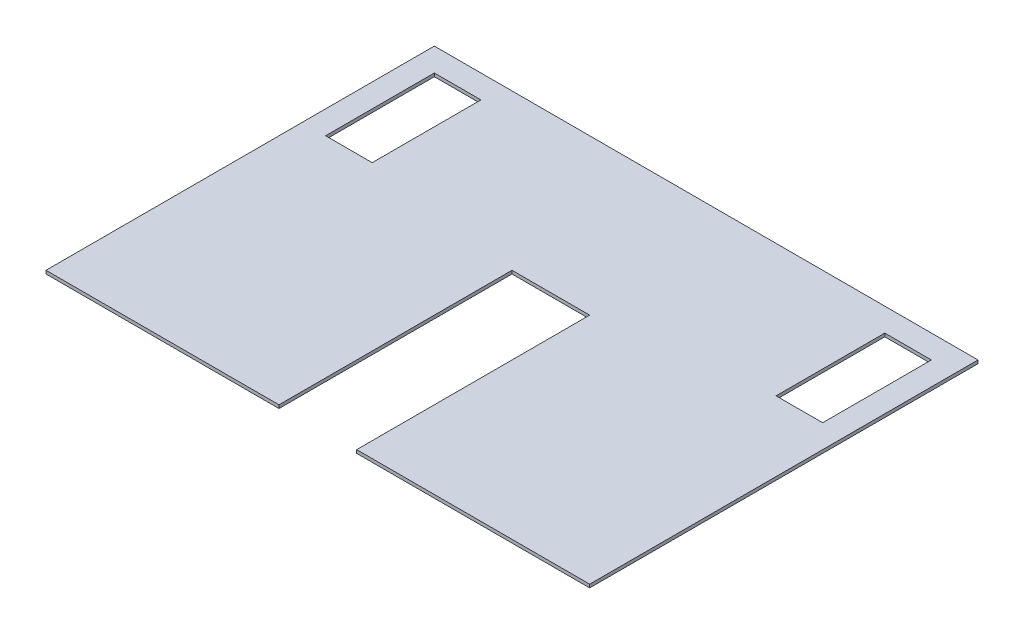
ISO-10303-21;
HEADER;
FILE_DESCRIPTION(('STEP AP214'),'2;1');
FILE_NAME('part.step','',(''),(''),'','','');
FILE_SCHEMA(('AUTOMOTIVE_DESIGN { 1 0 10303 214 1 1 1 1 }'));
ENDSEC;
DATA;
#1=APPLICATION_CONTEXT('core data for automotive mechanical design processes');
#2=APPLICATION_PROTOCOL_DEFINITION('international standard','automotive_design',2000,#1);
#3=PRODUCT_CONTEXT('',#1,'mechanical');
#4=PRODUCT('Part','Part','',(#3));
#5=PRODUCT_RELATED_PRODUCT_CATEGORY('part','',(#4));
#6=PRODUCT_DEFINITION_FORMATION('','',#4);
#7=PRODUCT_DEFINITION_CONTEXT('part definition',#1,'design');
#8=PRODUCT_DEFINITION('design','',#6,#7);
#9=PRODUCT_DEFINITION_SHAPE('','',#8);
#10=(LENGTH_UNIT() NAMED_UNIT(*) SI_UNIT(.MILLI.,.METRE.));
#11=(NAMED_UNIT(*) PLANE_ANGLE_UNIT() SI_UNIT($,.RADIAN.));
#12=(NAMED_UNIT(*) SI_UNIT($,.STERADIAN.) SOLID_ANGLE_UNIT());
#13=UNCERTAINTY_MEASURE_WITH_UNIT(LENGTH_MEASURE(1.E-05),#10,'distance_accuracy_value','');
#14=(GEOMETRIC_REPRESENTATION_CONTEXT(3) GLOBAL_UNCERTAINTY_ASSIGNED_CONTEXT((#13)) GLOBAL_UNIT_ASSIGNED_CONTEXT((#10,
#11,#12)) REPRESENTATION_CONTEXT('',''));
#15=CARTESIAN_POINT('',(0.,0.,0.));
#16=DIRECTION('',(0.,0.,1.));
#17=DIRECTION('',(1.,0.,0.));
#18=AXIS2_PLACEMENT_3D('',#15,#16,#17);
#19=CARTESIAN_POINT('',(0.,1.0668,0.));
#20=DIRECTION('',(0.,0.,-1.));
#21=DIRECTION('',(-1.,0.,0.));
#22=AXIS2_PLACEMENT_3D('',#19,#20,#21);
#23=PLANE('',#22);
#24=DIRECTION('',(1.,0.,0.));
#25=VECTOR('',#24,1.);
#26=CARTESIAN_POINT('',(0.,0.,0.));
#27=LINE('',#26,#25);
#28=CARTESIAN_POINT('',(-177.8,0.,0.));
#29=VERTEX_POINT('',#28);
#30=CARTESIAN_POINT('',(-101.6,0.,0.));
#31=VERTEX_POINT('',#30);
#32=EDGE_CURVE('E247',#29,#31,#27,.T.);
#33=ORIENTED_EDGE('',*,*,#32,.T.);
#34=DIRECTION('',(0.,1.,0.));
#35=VECTOR('',#34,1.);
#36=CARTESIAN_POINT('',(-101.6,0.,0.));
#37=LINE('',#36,#35);
#38=CARTESIAN_POINT('',(-101.6,1.0668,0.));
#39=VERTEX_POINT('',#38);
#40=EDGE_CURVE('E234',#31,#39,#37,.T.);
#41=ORIENTED_EDGE('',*,*,#40,.T.);
#42=DIRECTION('',(1.,0.,0.));
#43=VECTOR('',#42,1.);
#44=CARTESIAN_POINT('',(0.,1.0668,0.));
#45=LINE('',#44,#43);
#46=CARTESIAN_POINT('',(-177.8,1.0668,0.));
#47=VERTEX_POINT('',#46);
#48=EDGE_CURVE('E252',#47,#39,#45,.T.);
#49=ORIENTED_EDGE('',*,*,#48,.F.);
#50=DIRECTION('',(0.,-1.,0.));
#51=VECTOR('',#50,1.);
#52=CARTESIAN_POINT('',(-177.8,1.0668,0.));
#53=LINE('',#52,#51);
#54=EDGE_CURVE('E267',#47,#29,#53,.T.);
#55=ORIENTED_EDGE('',*,*,#54,.T.);
#56=EDGE_LOOP('',(#33,#41,#49,#55));
#57=FACE_BOUND('',#56,.T.);
#58=ADVANCED_FACE('F35',(#57),#23,.F.);
#59=CARTESIAN_POINT('',(0.,1.0668,0.));
#60=DIRECTION('',(-1.,0.,0.));
#61=DIRECTION('',(0.,0.,1.));
#62=AXIS2_PLACEMENT_3D('',#59,#60,#61);
#63=PLANE('',#62);
#64=DIRECTION('',(0.,0.,-1.));
#65=VECTOR('',#64,1.);
#66=CARTESIAN_POINT('',(0.,0.,0.));
#67=LINE('',#66,#65);
#68=CARTESIAN_POINT('',(0.,0.,0.));
#69=VERTEX_POINT('',#68);
#70=CARTESIAN_POINT('',(0.,0.,-127.));
#71=VERTEX_POINT('',#70);
#72=EDGE_CURVE('E237',#69,#71,#67,.T.);
#73=ORIENTED_EDGE('',*,*,#72,.T.);
#74=DIRECTION('',(0.,-1.,0.));
#75=VECTOR('',#74,1.);
#76=CARTESIAN_POINT('',(0.,1.0668,-127.));
#77=LINE('',#76,#75);
#78=CARTESIAN_POINT('',(0.,1.0668,-127.));
#79=VERTEX_POINT('',#78);
#80=EDGE_CURVE('E11',#79,#71,#77,.T.);
#81=ORIENTED_EDGE('',*,*,#80,.F.);
#82=DIRECTION('',(0.,0.,-1.));
#83=VECTOR('',#82,1.);
#84=CARTESIAN_POINT('',(0.,1.0668,0.));
#85=LINE('',#84,#83);
#86=CARTESIAN_POINT('',(0.,1.0668,0.));
#87=VERTEX_POINT('',#86);
#88=EDGE_CURVE('E243',#87,#79,#85,.T.);
#89=ORIENTED_EDGE('',*,*,#88,.F.);
#90=DIRECTION('',(0.,-1.,0.));
#91=VECTOR('',#90,1.);
#92=CARTESIAN_POINT('',(0.,1.0668,0.));
#93=LINE('',#92,#91);
#94=EDGE_CURVE('E255',#87,#69,#93,.T.);
#95=ORIENTED_EDGE('',*,*,#94,.T.);
#96=EDGE_LOOP('',(#73,#81,#89,#95));
#97=FACE_BOUND('',#96,.T.);
#98=ADVANCED_FACE('F37',(#97),#63,.F.);
#99=CARTESIAN_POINT('',(0.,1.0668,-127.));
#100=DIRECTION('',(0.,0.,1.));
#101=DIRECTION('',(1.,0.,0.));
#102=AXIS2_PLACEMENT_3D('',#99,#100,#101);
#103=PLANE('',#102);
#104=DIRECTION('',(-1.,0.,0.));
#105=VECTOR('',#104,1.);
#106=CARTESIAN_POINT('',(0.,0.,-127.));
#107=LINE('',#106,#105);
#108=CARTESIAN_POINT('',(-177.8,0.,-127.));
#109=VERTEX_POINT('',#108);
#110=EDGE_CURVE('E258',#71,#109,#107,.T.);
#111=ORIENTED_EDGE('',*,*,#110,.T.);
#112=DIRECTION('',(0.,-1.,0.));
#113=VECTOR('',#112,1.);
#114=CARTESIAN_POINT('',(-177.8,1.0668,-127.));
#115=LINE('',#114,#113);
#116=CARTESIAN_POINT('',(-177.8,1.0668,-127.));
#117=VERTEX_POINT('',#116);
#118=EDGE_CURVE('E43',#117,#109,#115,.T.);
#119=ORIENTED_EDGE('',*,*,#118,.F.);
#120=DIRECTION('',(-1.,0.,0.));
#121=VECTOR('',#120,1.);
#122=CARTESIAN_POINT('',(0.,1.0668,-127.));
#123=LINE('',#122,#121);
#124=EDGE_CURVE('E246',#79,#117,#123,.T.);
#125=ORIENTED_EDGE('',*,*,#124,.F.);
#126=ORIENTED_EDGE('',*,*,#80,.T.);
#127=EDGE_LOOP('',(#111,#119,#125,#126));
#128=FACE_BOUND('',#127,.T.);
#129=ADVANCED_FACE('F289',(#128),#103,.F.);
#130=CARTESIAN_POINT('',(-177.8,1.0668,0.));
#131=DIRECTION('',(1.,0.,0.));
#132=DIRECTION('',(0.,0.,-1.));
#133=AXIS2_PLACEMENT_3D('',#130,#131,#132);
#134=PLANE('',#133);
#135=DIRECTION('',(0.,0.,1.));
#136=VECTOR('',#135,1.);
#137=CARTESIAN_POINT('',(-177.8,0.,0.));
#138=LINE('',#137,#136);
#139=EDGE_CURVE('E260',#109,#29,#138,.T.);
#140=ORIENTED_EDGE('',*,*,#139,.T.);
#141=ORIENTED_EDGE('',*,*,#54,.F.);
#142=DIRECTION('',(0.,0.,1.));
#143=VECTOR('',#142,1.);
#144=CARTESIAN_POINT('',(-177.8,1.0668,0.));
#145=LINE('',#144,#143);
#146=EDGE_CURVE('E249',#117,#47,#145,.T.);
#147=ORIENTED_EDGE('',*,*,#146,.F.);
#148=ORIENTED_EDGE('',*,*,#118,.T.);
#149=EDGE_LOOP('',(#140,#141,#147,#148));
#150=FACE_BOUND('',#149,.T.);
#151=ADVANCED_FACE('F274',(#150),#134,.F.);
#152=CARTESIAN_POINT('',(-76.1999999999999,1.0668,0.));
#153=VERTEX_POINT('',#152);
#154=EDGE_CURVE('E251',#153,#87,#45,.T.);
#155=ORIENTED_EDGE('',*,*,#154,.F.);
#156=DIRECTION('',(0.,1.,0.));
#157=VECTOR('',#156,1.);
#158=CARTESIAN_POINT('',(-76.1999999999999,0.,0.));
#159=LINE('',#158,#157);
#160=CARTESIAN_POINT('',(-76.1999999999999,0.,0.));
#161=VERTEX_POINT('',#160);
#162=EDGE_CURVE('E227',#161,#153,#159,.T.);
#163=ORIENTED_EDGE('',*,*,#162,.F.);
#164=EDGE_CURVE('E262',#161,#69,#27,.T.);
#165=ORIENTED_EDGE('',*,*,#164,.T.);
#166=ORIENTED_EDGE('',*,*,#94,.F.);
#167=EDGE_LOOP('',(#155,#163,#165,#166));
#168=FACE_BOUND('',#167,.T.);
#169=ADVANCED_FACE('F296',(#168),#23,.F.);
#170=CARTESIAN_POINT('',(0.,1.0668,0.));
#171=DIRECTION('',(0.,1.,0.));
#172=DIRECTION('',(0.,0.,1.));
#173=AXIS2_PLACEMENT_3D('',#170,#171,#172);
#174=PLANE('',#173);
#175=DIRECTION('',(-1.,0.,0.));
#176=VECTOR('',#175,1.);
#177=CARTESIAN_POINT('',(-7.62000000000001,1.0668,-119.38));
#178=LINE('',#177,#176);
#179=CARTESIAN_POINT('',(-7.62000000000001,1.0668,-119.38));
#180=VERTEX_POINT('',#179);
#181=CARTESIAN_POINT('',(-22.8599999999999,1.0668,-119.38));
#182=VERTEX_POINT('',#181);
#183=EDGE_CURVE('E50',#180,#182,#178,.T.);
#184=ORIENTED_EDGE('',*,*,#183,.F.);
#185=DIRECTION('',(0.,0.,-1.));
#186=VECTOR('',#185,1.);
#187=CARTESIAN_POINT('',(-7.62000000000001,1.0668,-119.38));
#188=LINE('',#187,#186);
#189=CARTESIAN_POINT('',(-7.62000000000001,1.0668,-83.8199999999995));
#190=VERTEX_POINT('',#189);
#191=EDGE_CURVE('E166',#190,#180,#188,.T.);
#192=ORIENTED_EDGE('',*,*,#191,.F.);
#193=DIRECTION('',(1.,0.,0.));
#194=VECTOR('',#193,1.);
#195=CARTESIAN_POINT('',(-22.8599999999999,1.0668,-83.8199999999995));
#196=LINE('',#195,#194);
#197=CARTESIAN_POINT('',(-22.8599999999999,1.0668,-83.8199999999995));
#198=VERTEX_POINT('',#197);
#199=EDGE_CURVE('E169',#198,#190,#196,.T.);
#200=ORIENTED_EDGE('',*,*,#199,.F.);
#201=DIRECTION('',(0.,0.,1.));
#202=VECTOR('',#201,1.);
#203=CARTESIAN_POINT('',(-22.8599999999999,1.0668,-119.38));
#204=LINE('',#203,#202);
#205=EDGE_CURVE('E175',#182,#198,#204,.T.);
#206=ORIENTED_EDGE('',*,*,#205,.F.);
#207=EDGE_LOOP('',(#184,#192,#200,#206));
#208=FACE_BOUND('',#207,.T.);
#209=DIRECTION('',(0.,0.,1.));
#210=VECTOR('',#209,1.);
#211=CARTESIAN_POINT('',(-170.18,1.0668,-119.38));
#212=LINE('',#211,#210);
#213=CARTESIAN_POINT('',(-170.18,1.0668,-119.38));
#214=VERTEX_POINT('',#213);
#215=CARTESIAN_POINT('',(-170.18,1.0668,-83.8200000000001));
#216=VERTEX_POINT('',#215);
#217=EDGE_CURVE('E181',#214,#216,#212,.T.);
#218=ORIENTED_EDGE('',*,*,#217,.F.);
#219=DIRECTION('',(-1.,0.,0.));
#220=VECTOR('',#219,1.);
#221=CARTESIAN_POINT('',(-154.94,1.0668,-119.38));
#222=LINE('',#221,#220);
#223=CARTESIAN_POINT('',(-154.94,1.0668,-119.38));
#224=VERTEX_POINT('',#223);
#225=EDGE_CURVE('E189',#224,#214,#222,.T.);
#226=ORIENTED_EDGE('',*,*,#225,.F.);
#227=DIRECTION('',(0.,0.,-1.));
#228=VECTOR('',#227,1.);
#229=CARTESIAN_POINT('',(-154.94,1.0668,-83.8200000000001));
#230=LINE('',#229,#228);
#231=CARTESIAN_POINT('',(-154.94,1.0668,-83.8200000000001));
#232=VERTEX_POINT('',#231);
#233=EDGE_CURVE('E203',#232,#224,#230,.T.);
#234=ORIENTED_EDGE('',*,*,#233,.F.);
#235=DIRECTION('',(1.,0.,0.));
#236=VECTOR('',#235,1.);
#237=CARTESIAN_POINT('',(-170.18,1.0668,-83.8200000000001));
#238=LINE('',#237,#236);
#239=EDGE_CURVE('E200',#216,#232,#238,.T.);
#240=ORIENTED_EDGE('',*,*,#239,.F.);
#241=EDGE_LOOP('',(#218,#226,#234,#240));
#242=FACE_BOUND('',#241,.T.);
#243=DIRECTION('',(0.,0.,1.));
#244=VECTOR('',#243,1.);
#245=CARTESIAN_POINT('',(-101.6,1.0668,-76.1999999999995));
#246=LINE('',#245,#244);
#247=CARTESIAN_POINT('',(-101.6,1.0668,-76.1999999999995));
#248=VERTEX_POINT('',#247);
#249=EDGE_CURVE('E221',#248,#39,#246,.T.);
#250=ORIENTED_EDGE('',*,*,#249,.F.);
#251=DIRECTION('',(-1.,0.,0.));
#252=VECTOR('',#251,1.);
#253=CARTESIAN_POINT('',(-101.6,1.0668,-76.1999999999995));
#254=LINE('',#253,#252);
#255=CARTESIAN_POINT('',(-76.1999999999998,1.0668,-76.1999999999995));
#256=VERTEX_POINT('',#255);
#257=EDGE_CURVE('E230',#256,#248,#254,.T.);
#258=ORIENTED_EDGE('',*,*,#257,.F.);
#259=DIRECTION('',(0.,0.,-1.));
#260=VECTOR('',#259,1.);
#261=CARTESIAN_POINT('',(-76.1999999999998,1.0668,-76.1999999999995));
#262=LINE('',#261,#260);
#263=EDGE_CURVE('E210',#153,#256,#262,.T.);
#264=ORIENTED_EDGE('',*,*,#263,.F.);
#265=ORIENTED_EDGE('',*,*,#154,.T.);
#266=ORIENTED_EDGE('',*,*,#88,.T.);
#267=ORIENTED_EDGE('',*,*,#124,.T.);
#268=ORIENTED_EDGE('',*,*,#146,.T.);
#269=ORIENTED_EDGE('',*,*,#48,.T.);
#270=EDGE_LOOP('',(#250,#258,#264,#265,#266,#267,#268,#269));
#271=FACE_BOUND('',#270,.T.);
#272=ADVANCED_FACE('F285',(#208,#242,#271),#174,.T.);
#273=CARTESIAN_POINT('',(0.,0.,0.));
#274=DIRECTION('',(0.,1.,0.));
#275=DIRECTION('',(0.,0.,1.));
#276=AXIS2_PLACEMENT_3D('',#273,#274,#275);
#277=PLANE('',#276);
#278=DIRECTION('',(0.,0.,-1.));
#279=VECTOR('',#278,1.);
#280=CARTESIAN_POINT('',(-7.62000000000001,0.,-119.38));
#281=LINE('',#280,#279);
#282=CARTESIAN_POINT('',(-7.62000000000001,0.,-83.8199999999995));
#283=VERTEX_POINT('',#282);
#284=CARTESIAN_POINT('',(-7.62000000000001,0.,-119.38));
#285=VERTEX_POINT('',#284);
#286=EDGE_CURVE('E156',#283,#285,#281,.T.);
#287=ORIENTED_EDGE('',*,*,#286,.T.);
#288=DIRECTION('',(-1.,0.,0.));
#289=VECTOR('',#288,1.);
#290=CARTESIAN_POINT('',(-7.62000000000001,0.,-119.38));
#291=LINE('',#290,#289);
#292=CARTESIAN_POINT('',(-22.8599999999999,0.,-119.38));
#293=VERTEX_POINT('',#292);
#294=EDGE_CURVE('E150',#285,#293,#291,.T.);
#295=ORIENTED_EDGE('',*,*,#294,.T.);
#296=DIRECTION('',(0.,0.,1.));
#297=VECTOR('',#296,1.);
#298=CARTESIAN_POINT('',(-22.8599999999999,0.,-119.38));
#299=LINE('',#298,#297);
#300=CARTESIAN_POINT('',(-22.8599999999999,0.,-83.8199999999995));
#301=VERTEX_POINT('',#300);
#302=EDGE_CURVE('E159',#293,#301,#299,.T.);
#303=ORIENTED_EDGE('',*,*,#302,.T.);
#304=DIRECTION('',(1.,0.,0.));
#305=VECTOR('',#304,1.);
#306=CARTESIAN_POINT('',(-22.8599999999999,0.,-83.8199999999995));
#307=LINE('',#306,#305);
#308=EDGE_CURVE('E58',#301,#283,#307,.T.);
#309=ORIENTED_EDGE('',*,*,#308,.T.);
#310=EDGE_LOOP('',(#287,#295,#303,#309));
#311=FACE_BOUND('',#310,.T.);
#312=DIRECTION('',(-1.,0.,0.));
#313=VECTOR('',#312,1.);
#314=CARTESIAN_POINT('',(-154.94,0.,-119.38));
#315=LINE('',#314,#313);
#316=CARTESIAN_POINT('',(-154.94,0.,-119.38));
#317=VERTEX_POINT('',#316);
#318=CARTESIAN_POINT('',(-170.18,0.,-119.38));
#319=VERTEX_POINT('',#318);
#320=EDGE_CURVE('E195',#317,#319,#315,.T.);
#321=ORIENTED_EDGE('',*,*,#320,.T.);
#322=DIRECTION('',(0.,0.,1.));
#323=VECTOR('',#322,1.);
#324=CARTESIAN_POINT('',(-170.18,0.,-119.38));
#325=LINE('',#324,#323);
#326=CARTESIAN_POINT('',(-170.18,0.,-83.8200000000001));
#327=VERTEX_POINT('',#326);
#328=EDGE_CURVE('E185',#319,#327,#325,.T.);
#329=ORIENTED_EDGE('',*,*,#328,.T.);
#330=DIRECTION('',(1.,0.,0.));
#331=VECTOR('',#330,1.);
#332=CARTESIAN_POINT('',(-170.18,0.,-83.8200000000001));
#333=LINE('',#332,#331);
#334=CARTESIAN_POINT('',(-154.94,0.,-83.8200000000001));
#335=VERTEX_POINT('',#334);
#336=EDGE_CURVE('E188',#327,#335,#333,.T.);
#337=ORIENTED_EDGE('',*,*,#336,.T.);
#338=DIRECTION('',(0.,0.,-1.));
#339=VECTOR('',#338,1.);
#340=CARTESIAN_POINT('',(-154.94,0.,-83.8200000000001));
#341=LINE('',#340,#339);
#342=EDGE_CURVE('E192',#335,#317,#341,.T.);
#343=ORIENTED_EDGE('',*,*,#342,.T.);
#344=EDGE_LOOP('',(#321,#329,#337,#343));
#345=FACE_BOUND('',#344,.T.);
#346=DIRECTION('',(-1.,0.,0.));
#347=VECTOR('',#346,1.);
#348=CARTESIAN_POINT('',(-101.6,0.,-76.1999999999995));
#349=LINE('',#348,#347);
#350=CARTESIAN_POINT('',(-76.1999999999998,0.,-76.1999999999995));
#351=VERTEX_POINT('',#350);
#352=CARTESIAN_POINT('',(-101.6,0.,-76.1999999999995));
#353=VERTEX_POINT('',#352);
#354=EDGE_CURVE('E220',#351,#353,#349,.T.);
#355=ORIENTED_EDGE('',*,*,#354,.T.);
#356=DIRECTION('',(0.,0.,1.));
#357=VECTOR('',#356,1.);
#358=CARTESIAN_POINT('',(-101.6,0.,-76.1999999999995));
#359=LINE('',#358,#357);
#360=EDGE_CURVE('E224',#353,#31,#359,.T.);
#361=ORIENTED_EDGE('',*,*,#360,.T.);
#362=ORIENTED_EDGE('',*,*,#32,.F.);
#363=ORIENTED_EDGE('',*,*,#139,.F.);
#364=ORIENTED_EDGE('',*,*,#110,.F.);
#365=ORIENTED_EDGE('',*,*,#72,.F.);
#366=ORIENTED_EDGE('',*,*,#164,.F.);
#367=DIRECTION('',(0.,0.,-1.));
#368=VECTOR('',#367,1.);
#369=CARTESIAN_POINT('',(-76.1999999999998,0.,-76.1999999999995));
#370=LINE('',#369,#368);
#371=EDGE_CURVE('E217',#161,#351,#370,.T.);
#372=ORIENTED_EDGE('',*,*,#371,.T.);
#373=EDGE_LOOP('',(#355,#361,#362,#363,#364,#365,#366,#372));
#374=FACE_BOUND('',#373,.T.);
#375=ADVANCED_FACE('F163',(#311,#345,#374),#277,.F.);
#376=CARTESIAN_POINT('',(-101.6,0.,-76.1999999999995));
#377=DIRECTION('',(-1.,0.,0.));
#378=DIRECTION('',(0.,0.,1.));
#379=AXIS2_PLACEMENT_3D('',#376,#377,#378);
#380=PLANE('',#379);
#381=ORIENTED_EDGE('',*,*,#249,.T.);
#382=ORIENTED_EDGE('',*,*,#40,.F.);
#383=ORIENTED_EDGE('',*,*,#360,.F.);
#384=DIRECTION('',(0.,1.,0.));
#385=VECTOR('',#384,1.);
#386=CARTESIAN_POINT('',(-101.6,0.,-76.1999999999995));
#387=LINE('',#386,#385);
#388=EDGE_CURVE('E238',#353,#248,#387,.T.);
#389=ORIENTED_EDGE('',*,*,#388,.T.);
#390=EDGE_LOOP('',(#381,#382,#383,#389));
#391=FACE_BOUND('',#390,.T.);
#392=ADVANCED_FACE('F304',(#391),#380,.F.);
#393=CARTESIAN_POINT('',(-101.6,0.,-76.1999999999995));
#394=DIRECTION('',(0.,0.,-1.));
#395=DIRECTION('',(-1.,0.,0.));
#396=AXIS2_PLACEMENT_3D('',#393,#394,#395);
#397=PLANE('',#396);
#398=ORIENTED_EDGE('',*,*,#257,.T.);
#399=ORIENTED_EDGE('',*,*,#388,.F.);
#400=ORIENTED_EDGE('',*,*,#354,.F.);
#401=DIRECTION('',(0.,1.,0.));
#402=VECTOR('',#401,1.);
#403=CARTESIAN_POINT('',(-76.1999999999998,0.,-76.1999999999995));
#404=LINE('',#403,#402);
#405=EDGE_CURVE('E240',#351,#256,#404,.T.);
#406=ORIENTED_EDGE('',*,*,#405,.T.);
#407=EDGE_LOOP('',(#398,#399,#400,#406));
#408=FACE_BOUND('',#407,.T.);
#409=ADVANCED_FACE('F302',(#408),#397,.F.);
#410=CARTESIAN_POINT('',(-76.1999999999998,0.,-76.1999999999995));
#411=DIRECTION('',(1.,0.,0.));
#412=DIRECTION('',(0.,0.,-1.));
#413=AXIS2_PLACEMENT_3D('',#410,#411,#412);
#414=PLANE('',#413);
#415=ORIENTED_EDGE('',*,*,#263,.T.);
#416=ORIENTED_EDGE('',*,*,#405,.F.);
#417=ORIENTED_EDGE('',*,*,#371,.F.);
#418=ORIENTED_EDGE('',*,*,#162,.T.);
#419=EDGE_LOOP('',(#415,#416,#417,#418));
#420=FACE_BOUND('',#419,.T.);
#421=ADVANCED_FACE('F299',(#420),#414,.F.);
#422=CARTESIAN_POINT('',(-170.18,0.,-119.38));
#423=DIRECTION('',(-1.,0.,0.));
#424=DIRECTION('',(0.,0.,1.));
#425=AXIS2_PLACEMENT_3D('',#422,#423,#424);
#426=PLANE('',#425);
#427=ORIENTED_EDGE('',*,*,#217,.T.);
#428=DIRECTION('',(0.,1.,0.));
#429=VECTOR('',#428,1.);
#430=CARTESIAN_POINT('',(-170.18,0.,-83.8200000000001));
#431=LINE('',#430,#429);
#432=EDGE_CURVE('E198',#327,#216,#431,.T.);
#433=ORIENTED_EDGE('',*,*,#432,.F.);
#434=ORIENTED_EDGE('',*,*,#328,.F.);
#435=DIRECTION('',(0.,1.,0.));
#436=VECTOR('',#435,1.);
#437=CARTESIAN_POINT('',(-170.18,0.,-119.38));
#438=LINE('',#437,#436);
#439=EDGE_CURVE('E208',#319,#214,#438,.T.);
#440=ORIENTED_EDGE('',*,*,#439,.T.);
#441=EDGE_LOOP('',(#427,#433,#434,#440));
#442=FACE_BOUND('',#441,.T.);
#443=ADVANCED_FACE('F379',(#442),#426,.F.);
#444=CARTESIAN_POINT('',(-154.94,0.,-119.38));
#445=DIRECTION('',(0.,0.,-1.));
#446=DIRECTION('',(-1.,0.,0.));
#447=AXIS2_PLACEMENT_3D('',#444,#445,#446);
#448=PLANE('',#447);
#449=ORIENTED_EDGE('',*,*,#225,.T.);
#450=ORIENTED_EDGE('',*,*,#439,.F.);
#451=ORIENTED_EDGE('',*,*,#320,.F.);
#452=DIRECTION('',(0.,1.,0.));
#453=VECTOR('',#452,1.);
#454=CARTESIAN_POINT('',(-154.94,0.,-119.38));
#455=LINE('',#454,#453);
#456=EDGE_CURVE('E211',#317,#224,#455,.T.);
#457=ORIENTED_EDGE('',*,*,#456,.T.);
#458=EDGE_LOOP('',(#449,#450,#451,#457));
#459=FACE_BOUND('',#458,.T.);
#460=ADVANCED_FACE('F387',(#459),#448,.F.);
#461=CARTESIAN_POINT('',(-154.94,0.,-83.8200000000001));
#462=DIRECTION('',(1.,0.,0.));
#463=DIRECTION('',(0.,0.,-1.));
#464=AXIS2_PLACEMENT_3D('',#461,#462,#463);
#465=PLANE('',#464);
#466=ORIENTED_EDGE('',*,*,#233,.T.);
#467=ORIENTED_EDGE('',*,*,#456,.F.);
#468=ORIENTED_EDGE('',*,*,#342,.F.);
#469=DIRECTION('',(0.,1.,0.));
#470=VECTOR('',#469,1.);
#471=CARTESIAN_POINT('',(-154.94,0.,-83.8200000000001));
#472=LINE('',#471,#470);
#473=EDGE_CURVE('E213',#335,#232,#472,.T.);
#474=ORIENTED_EDGE('',*,*,#473,.T.);
#475=EDGE_LOOP('',(#466,#467,#468,#474));
#476=FACE_BOUND('',#475,.T.);
#477=ADVANCED_FACE('F395',(#476),#465,.F.);
#478=CARTESIAN_POINT('',(-170.18,0.,-83.8200000000001));
#479=DIRECTION('',(0.,0.,1.));
#480=DIRECTION('',(1.,0.,0.));
#481=AXIS2_PLACEMENT_3D('',#478,#479,#480);
#482=PLANE('',#481);
#483=ORIENTED_EDGE('',*,*,#239,.T.);
#484=ORIENTED_EDGE('',*,*,#473,.F.);
#485=ORIENTED_EDGE('',*,*,#336,.F.);
#486=ORIENTED_EDGE('',*,*,#432,.T.);
#487=EDGE_LOOP('',(#483,#484,#485,#486));
#488=FACE_BOUND('',#487,.T.);
#489=ADVANCED_FACE('F404',(#488),#482,.F.);
#490=CARTESIAN_POINT('',(-7.62000000000001,0.,-119.38));
#491=DIRECTION('',(0.,0.,-1.));
#492=DIRECTION('',(-1.,0.,0.));
#493=AXIS2_PLACEMENT_3D('',#490,#491,#492);
#494=PLANE('',#493);
#495=ORIENTED_EDGE('',*,*,#183,.T.);
#496=DIRECTION('',(0.,1.,0.));
#497=VECTOR('',#496,1.);
#498=CARTESIAN_POINT('',(-22.8599999999999,0.,-119.38));
#499=LINE('',#498,#497);
#500=EDGE_CURVE('E146',#293,#182,#499,.T.);
#501=ORIENTED_EDGE('',*,*,#500,.F.);
#502=ORIENTED_EDGE('',*,*,#294,.F.);
#503=DIRECTION('',(0.,1.,0.));
#504=VECTOR('',#503,1.);
#505=CARTESIAN_POINT('',(-7.62000000000001,0.,-119.38));
#506=LINE('',#505,#504);
#507=EDGE_CURVE('E179',#285,#180,#506,.T.);
#508=ORIENTED_EDGE('',*,*,#507,.T.);
#509=EDGE_LOOP('',(#495,#501,#502,#508));
#510=FACE_BOUND('',#509,.T.);
#511=ADVANCED_FACE('F148',(#510),#494,.F.);
#512=CARTESIAN_POINT('',(-7.62000000000001,0.,-119.38));
#513=DIRECTION('',(1.,0.,0.));
#514=DIRECTION('',(0.,0.,-1.));
#515=AXIS2_PLACEMENT_3D('',#512,#513,#514);
#516=PLANE('',#515);
#517=ORIENTED_EDGE('',*,*,#191,.T.);
#518=ORIENTED_EDGE('',*,*,#507,.F.);
#519=ORIENTED_EDGE('',*,*,#286,.F.);
#520=DIRECTION('',(0.,1.,0.));
#521=VECTOR('',#520,1.);
#522=CARTESIAN_POINT('',(-7.62000000000001,0.,-83.8199999999995));
#523=LINE('',#522,#521);
#524=EDGE_CURVE('E182',#283,#190,#523,.T.);
#525=ORIENTED_EDGE('',*,*,#524,.T.);
#526=EDGE_LOOP('',(#517,#518,#519,#525));
#527=FACE_BOUND('',#526,.T.);
#528=ADVANCED_FACE('F421',(#527),#516,.F.);
#529=CARTESIAN_POINT('',(-22.8599999999999,0.,-83.8199999999995));
#530=DIRECTION('',(0.,0.,1.));
#531=DIRECTION('',(1.,0.,0.));
#532=AXIS2_PLACEMENT_3D('',#529,#530,#531);
#533=PLANE('',#532);
#534=ORIENTED_EDGE('',*,*,#199,.T.);
#535=ORIENTED_EDGE('',*,*,#524,.F.);
#536=ORIENTED_EDGE('',*,*,#308,.F.);
#537=DIRECTION('',(0.,1.,0.));
#538=VECTOR('',#537,1.);
#539=CARTESIAN_POINT('',(-22.8599999999999,0.,-83.8199999999995));
#540=LINE('',#539,#538);
#541=EDGE_CURVE('E155',#301,#198,#540,.T.);
#542=ORIENTED_EDGE('',*,*,#541,.T.);
#543=EDGE_LOOP('',(#534,#535,#536,#542));
#544=FACE_BOUND('',#543,.T.);
#545=ADVANCED_FACE('F429',(#544),#533,.F.);
#546=CARTESIAN_POINT('',(-22.8599999999999,0.,-119.38));
#547=DIRECTION('',(-1.,0.,0.));
#548=DIRECTION('',(0.,0.,1.));
#549=AXIS2_PLACEMENT_3D('',#546,#547,#548);
#550=PLANE('',#549);
#551=ORIENTED_EDGE('',*,*,#205,.T.);
#552=ORIENTED_EDGE('',*,*,#541,.F.);
#553=ORIENTED_EDGE('',*,*,#302,.F.);
#554=ORIENTED_EDGE('',*,*,#500,.T.);
#555=EDGE_LOOP('',(#551,#552,#553,#554));
#556=FACE_BOUND('',#555,.T.);
#557=ADVANCED_FACE('F160',(#556),#550,.F.);
#558=CLOSED_SHELL('',(#58,#98,#129,#151,#169,#272,#375,#392,#409,#421,#443,#460,#477,#489,#511,
#528,#545,#557));
#559=MANIFOLD_SOLID_BREP('B2',#558);
#560=ADVANCED_BREP_SHAPE_REPRESENTATION('',(#18,#559),#14);
#561=SHAPE_DEFINITION_REPRESENTATION(#9,#560);
ENDSEC;
END-ISO-10303-21;
